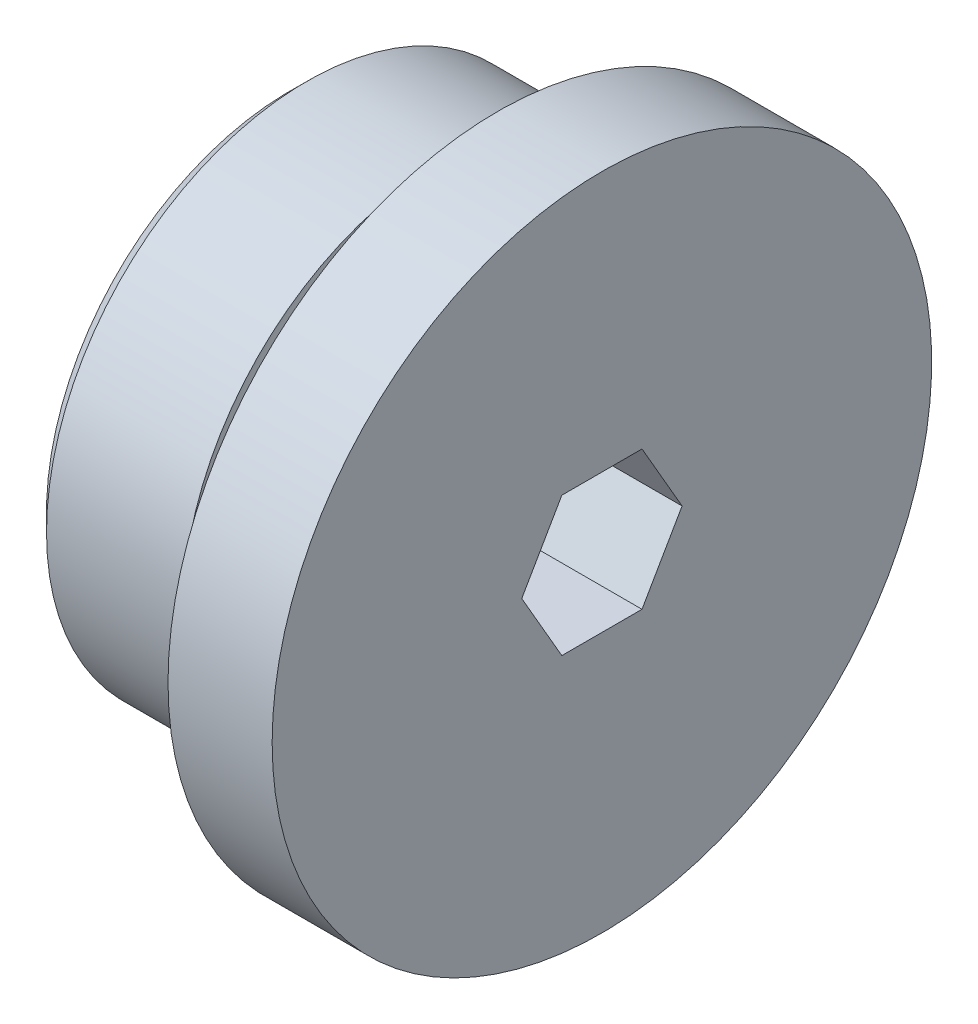
ISO-10303-21;
HEADER;
FILE_DESCRIPTION(('STEP AP214'),'2;1');
FILE_NAME('part.step','',(''),(''),'','','');
FILE_SCHEMA(('AUTOMOTIVE_DESIGN { 1 0 10303 214 1 1 1 1 }'));
ENDSEC;
DATA;
#1=APPLICATION_CONTEXT('core data for automotive mechanical design processes');
#2=APPLICATION_PROTOCOL_DEFINITION('international standard','automotive_design',2000,#1);
#3=PRODUCT_CONTEXT('',#1,'mechanical');
#4=PRODUCT('Part','Part','',(#3));
#5=PRODUCT_RELATED_PRODUCT_CATEGORY('part','',(#4));
#6=PRODUCT_DEFINITION_FORMATION('','',#4);
#7=PRODUCT_DEFINITION_CONTEXT('part definition',#1,'design');
#8=PRODUCT_DEFINITION('design','',#6,#7);
#9=PRODUCT_DEFINITION_SHAPE('','',#8);
#10=(LENGTH_UNIT() NAMED_UNIT(*) SI_UNIT(.MILLI.,.METRE.));
#11=(NAMED_UNIT(*) PLANE_ANGLE_UNIT() SI_UNIT($,.RADIAN.));
#12=(NAMED_UNIT(*) SI_UNIT($,.STERADIAN.) SOLID_ANGLE_UNIT());
#13=UNCERTAINTY_MEASURE_WITH_UNIT(LENGTH_MEASURE(1.E-05),#10,'distance_accuracy_value','');
#14=(GEOMETRIC_REPRESENTATION_CONTEXT(3) GLOBAL_UNCERTAINTY_ASSIGNED_CONTEXT((#13)) GLOBAL_UNIT_ASSIGNED_CONTEXT((#10,
#11,#12)) REPRESENTATION_CONTEXT('',''));
#15=CARTESIAN_POINT('',(0.,0.,0.));
#16=DIRECTION('',(0.,0.,1.));
#17=DIRECTION('',(1.,0.,0.));
#18=AXIS2_PLACEMENT_3D('',#15,#16,#17);
#19=CARTESIAN_POINT('',(18.,19.,0.));
#20=DIRECTION('',(-1.,0.,0.));
#21=DIRECTION('',(0.,0.,0.999999999999997));
#22=AXIS2_PLACEMENT_3D('',#19,#20,#21);
#23=PLANE('',#22);
#24=DIRECTION('',(0.,0.,-0.999999999999997));
#25=VECTOR('',#24,1.);
#26=CARTESIAN_POINT('',(18.,-3.99999999999996,2.30940107675849));
#27=LINE('',#26,#25);
#28=CARTESIAN_POINT('',(18.,-3.99999999999996,2.30940107675849));
#29=VERTEX_POINT('',#28);
#30=CARTESIAN_POINT('',(18.,-3.9999999999999,-2.3094010767586));
#31=VERTEX_POINT('',#30);
#32=EDGE_CURVE('E49',#29,#31,#27,.T.);
#33=ORIENTED_EDGE('',*,*,#32,.F.);
#34=DIRECTION('',(0.,-0.866025403784436,-0.499999999999991));
#35=VECTOR('',#34,1.);
#36=CARTESIAN_POINT('',(18.0000000000001,0.,4.6188021535169));
#37=LINE('',#36,#35);
#38=CARTESIAN_POINT('',(18.0000000000001,0.,4.6188021535169));
#39=VERTEX_POINT('',#38);
#40=EDGE_CURVE('E125',#39,#29,#37,.T.);
#41=ORIENTED_EDGE('',*,*,#40,.F.);
#42=DIRECTION('',(0.,-0.866025403784442,0.499999999999993));
#43=VECTOR('',#42,1.);
#44=CARTESIAN_POINT('',(18.0000000000001,0.,4.6188021535169));
#45=LINE('',#44,#43);
#46=CARTESIAN_POINT('',(18.0000000000001,4.00000000000009,2.30940107675844));
#47=VERTEX_POINT('',#46);
#48=EDGE_CURVE('E119',#47,#39,#45,.T.);
#49=ORIENTED_EDGE('',*,*,#48,.F.);
#50=DIRECTION('',(0.,0.,0.999999999999997));
#51=VECTOR('',#50,1.);
#52=CARTESIAN_POINT('',(18.0000000000001,4.00000000000009,2.30940107675844));
#53=LINE('',#52,#51);
#54=CARTESIAN_POINT('',(18.,4.00000000000005,-2.30940107675849));
#55=VERTEX_POINT('',#54);
#56=EDGE_CURVE('E157',#55,#47,#53,.T.);
#57=ORIENTED_EDGE('',*,*,#56,.F.);
#58=DIRECTION('',(0.,0.866025403784436,0.499999999999991));
#59=VECTOR('',#58,1.);
#60=CARTESIAN_POINT('',(18.,0.,-4.61880215351697));
#61=LINE('',#60,#59);
#62=CARTESIAN_POINT('',(18.,0.,-4.61880215351697));
#63=VERTEX_POINT('',#62);
#64=EDGE_CURVE('E154',#63,#55,#61,.T.);
#65=ORIENTED_EDGE('',*,*,#64,.F.);
#66=DIRECTION('',(0.,0.866025403784442,-0.499999999999993));
#67=VECTOR('',#66,1.);
#68=CARTESIAN_POINT('',(18.,0.,-4.61880215351697));
#69=LINE('',#68,#67);
#70=EDGE_CURVE('E151',#31,#63,#69,.T.);
#71=ORIENTED_EDGE('',*,*,#70,.F.);
#72=EDGE_LOOP('',(#33,#41,#49,#57,#65,#71));
#73=FACE_BOUND('',#72,.T.);
#74=CARTESIAN_POINT('',(18.,0.,0.));
#75=DIRECTION('',(-1.,0.,0.));
#76=DIRECTION('',(0.,0.,0.999999999999997));
#77=AXIS2_PLACEMENT_3D('',#74,#75,#76);
#78=CIRCLE('',#77,19.);
#79=CARTESIAN_POINT('',(18.0000000000001,0.,18.9999999999999));
#80=VERTEX_POINT('',#79);
#81=EDGE_CURVE('E187',#80,#80,#78,.T.);
#82=ORIENTED_EDGE('',*,*,#81,.F.);
#83=EDGE_LOOP('',(#82));
#84=FACE_BOUND('',#83,.T.);
#85=ADVANCED_FACE('F34',(#73,#84),#23,.F.);
#86=CARTESIAN_POINT('',(0.,0.,0.));
#87=DIRECTION('',(-1.,0.,0.));
#88=DIRECTION('',(0.,0.,0.999999999999997));
#89=AXIS2_PLACEMENT_3D('',#86,#87,#88);
#90=CYLINDRICAL_SURFACE('',#89,19.);
#91=CARTESIAN_POINT('',(12.0000000000001,0.,0.));
#92=DIRECTION('',(-1.,0.,0.));
#93=DIRECTION('',(0.,0.,0.999999999999997));
#94=AXIS2_PLACEMENT_3D('',#91,#92,#93);
#95=CIRCLE('',#94,19.);
#96=CARTESIAN_POINT('',(12.0000000000001,0.,18.9999999999999));
#97=VERTEX_POINT('',#96);
#98=EDGE_CURVE('E184',#97,#97,#95,.T.);
#99=ORIENTED_EDGE('',*,*,#98,.F.);
#100=EDGE_LOOP('',(#99));
#101=FACE_BOUND('',#100,.T.);
#102=ORIENTED_EDGE('',*,*,#81,.T.);
#103=EDGE_LOOP('',(#102));
#104=FACE_BOUND('',#103,.T.);
#105=ADVANCED_FACE('F242',(#101,#104),#90,.T.);
#106=CARTESIAN_POINT('',(12.,15.0000000000001,0.));
#107=DIRECTION('',(1.,0.,0.));
#108=DIRECTION('',(0.,0.,-0.999999999999997));
#109=AXIS2_PLACEMENT_3D('',#106,#107,#108);
#110=PLANE('',#109);
#111=CARTESIAN_POINT('',(12.0000000000001,0.,0.));
#112=DIRECTION('',(-1.,0.,0.));
#113=DIRECTION('',(0.,0.,0.999999999999997));
#114=AXIS2_PLACEMENT_3D('',#111,#112,#113);
#115=CIRCLE('',#114,15.);
#116=CARTESIAN_POINT('',(12.0000000000001,0.,14.9999999999999));
#117=VERTEX_POINT('',#116);
#118=EDGE_CURVE('E181',#117,#117,#115,.T.);
#119=ORIENTED_EDGE('',*,*,#118,.F.);
#120=EDGE_LOOP('',(#119));
#121=FACE_BOUND('',#120,.T.);
#122=ORIENTED_EDGE('',*,*,#98,.T.);
#123=EDGE_LOOP('',(#122));
#124=FACE_BOUND('',#123,.T.);
#125=ADVANCED_FACE('F246',(#121,#124),#110,.F.);
#126=CARTESIAN_POINT('',(10.430076842212,0.,0.));
#127=DIRECTION('',(-1.,0.,0.));
#128=DIRECTION('',(0.,0.,0.999999999999997));
#129=AXIS2_PLACEMENT_3D('',#126,#127,#128);
#130=TOROIDAL_SURFACE('',#129,15.,1.56992315778797);
#131=CARTESIAN_POINT('',(8.86015368442411,1.11022302462516E-13,-1.38777878078145E-13));
#132=DIRECTION('',(-1.,0.,0.));
#133=DIRECTION('',(0.,0.,0.999999999999997));
#134=AXIS2_PLACEMENT_3D('',#131,#132,#133);
#135=CIRCLE('',#134,15.);
#136=CARTESIAN_POINT('',(8.86015368442412,0.,14.9999999999998));
#137=VERTEX_POINT('',#136);
#138=EDGE_CURVE('E178',#137,#137,#135,.T.);
#139=ORIENTED_EDGE('',*,*,#138,.F.);
#140=EDGE_LOOP('',(#139));
#141=FACE_BOUND('',#140,.T.);
#142=ORIENTED_EDGE('',*,*,#118,.T.);
#143=EDGE_LOOP('',(#142));
#144=FACE_BOUND('',#143,.T.);
#145=ADVANCED_FACE('F252',(#141,#144),#130,.F.);
#146=CARTESIAN_POINT('',(0.,0.,0.));
#147=DIRECTION('',(-1.,0.,0.));
#148=DIRECTION('',(0.,0.,0.999999999999997));
#149=AXIS2_PLACEMENT_3D('',#146,#147,#148);
#150=CYLINDRICAL_SURFACE('',#149,15.);
#151=CARTESIAN_POINT('',(1.,0.,0.));
#152=DIRECTION('',(1.,0.,0.));
#153=DIRECTION('',(0.,0.,-0.999999999999997));
#154=AXIS2_PLACEMENT_3D('',#151,#152,#153);
#155=CIRCLE('',#154,15.);
#156=CARTESIAN_POINT('',(0.999999999999988,1.93178806284777E-13,-15.));
#157=VERTEX_POINT('',#156);
#158=EDGE_CURVE('E11',#157,#157,#155,.T.);
#159=ORIENTED_EDGE('',*,*,#158,.T.);
#160=EDGE_LOOP('',(#159));
#161=FACE_BOUND('',#160,.T.);
#162=ORIENTED_EDGE('',*,*,#138,.T.);
#163=EDGE_LOOP('',(#162));
#164=FACE_BOUND('',#163,.T.);
#165=ADVANCED_FACE('F256',(#161,#164),#150,.T.);
#166=CARTESIAN_POINT('',(0.,0.,0.));
#167=DIRECTION('',(1.,0.,0.));
#168=DIRECTION('',(0.,0.,-0.999999999999997));
#169=AXIS2_PLACEMENT_3D('',#166,#167,#168);
#170=PLANE('',#169);
#171=CARTESIAN_POINT('',(0.,0.,0.));
#172=DIRECTION('',(1.,0.,0.));
#173=DIRECTION('',(0.,0.,-0.999999999999997));
#174=AXIS2_PLACEMENT_3D('',#171,#172,#173);
#175=CIRCLE('',#174,14.);
#176=CARTESIAN_POINT('',(0.,1.78912440418344E-13,-14.));
#177=VERTEX_POINT('',#176);
#178=EDGE_CURVE('E42',#177,#177,#175,.F.);
#179=ORIENTED_EDGE('',*,*,#178,.T.);
#180=EDGE_LOOP('',(#179));
#181=FACE_BOUND('',#180,.T.);
#182=ADVANCED_FACE('F260',(#181),#170,.F.);
#183=CARTESIAN_POINT('',(10.,0.,4.61880215351694));
#184=DIRECTION('',(0.,-0.499999999999997,0.866025403784439));
#185=DIRECTION('',(0.,-0.866025403784436,-0.499999999999991));
#186=AXIS2_PLACEMENT_3D('',#183,#184,#185);
#187=PLANE('',#186);
#188=ORIENTED_EDGE('',*,*,#40,.T.);
#189=DIRECTION('',(1.,0.,0.));
#190=VECTOR('',#189,1.);
#191=CARTESIAN_POINT('',(9.99999999999998,-3.99999999999996,2.30940107675849));
#192=LINE('',#191,#190);
#193=CARTESIAN_POINT('',(9.99999999999998,-3.99999999999996,2.30940107675849));
#194=VERTEX_POINT('',#193);
#195=EDGE_CURVE('E122',#194,#29,#192,.T.);
#196=ORIENTED_EDGE('',*,*,#195,.F.);
#197=DIRECTION('',(0.,-0.866025403784436,-0.499999999999991));
#198=VECTOR('',#197,1.);
#199=CARTESIAN_POINT('',(10.,0.,4.61880215351694));
#200=LINE('',#199,#198);
#201=CARTESIAN_POINT('',(10.0000000000001,-1.99999999999984,3.46410161513759));
#202=VERTEX_POINT('',#201);
#203=EDGE_CURVE('E108',#202,#194,#200,.T.);
#204=ORIENTED_EDGE('',*,*,#203,.F.);
#205=CARTESIAN_POINT('',(10.,0.,4.61880215351694));
#206=VERTEX_POINT('',#205);
#207=EDGE_CURVE('E118',#206,#202,#200,.T.);
#208=ORIENTED_EDGE('',*,*,#207,.F.);
#209=DIRECTION('',(1.,0.,0.));
#210=VECTOR('',#209,1.);
#211=CARTESIAN_POINT('',(10.,0.,4.61880215351694));
#212=LINE('',#211,#210);
#213=EDGE_CURVE('E162',#206,#39,#212,.T.);
#214=ORIENTED_EDGE('',*,*,#213,.T.);
#215=EDGE_LOOP('',(#188,#196,#204,#208,#214));
#216=FACE_BOUND('',#215,.T.);
#217=ADVANCED_FACE('F123',(#216),#187,.F.);
#218=CARTESIAN_POINT('',(10.,0.,4.61880215351694));
#219=DIRECTION('',(0.,0.499999999999985,0.86602540378444));
#220=DIRECTION('',(0.,-0.866025403784442,0.499999999999993));
#221=AXIS2_PLACEMENT_3D('',#218,#219,#220);
#222=PLANE('',#221);
#223=ORIENTED_EDGE('',*,*,#48,.T.);
#224=ORIENTED_EDGE('',*,*,#213,.F.);
#225=DIRECTION('',(0.,-0.866025403784442,0.499999999999993));
#226=VECTOR('',#225,1.);
#227=CARTESIAN_POINT('',(10.,0.,4.61880215351694));
#228=LINE('',#227,#226);
#229=CARTESIAN_POINT('',(10.,2.00000000000002,3.46410161513776));
#230=VERTEX_POINT('',#229);
#231=EDGE_CURVE('E146',#230,#206,#228,.T.);
#232=ORIENTED_EDGE('',*,*,#231,.F.);
#233=CARTESIAN_POINT('',(10.,4.00000000000012,2.30940107675835));
#234=VERTEX_POINT('',#233);
#235=EDGE_CURVE('E128',#234,#230,#228,.T.);
#236=ORIENTED_EDGE('',*,*,#235,.F.);
#237=DIRECTION('',(1.,0.,0.));
#238=VECTOR('',#237,1.);
#239=CARTESIAN_POINT('',(10.,4.00000000000012,2.30940107675835));
#240=LINE('',#239,#238);
#241=EDGE_CURVE('E165',#234,#47,#240,.T.);
#242=ORIENTED_EDGE('',*,*,#241,.T.);
#243=EDGE_LOOP('',(#223,#224,#232,#236,#242));
#244=FACE_BOUND('',#243,.T.);
#245=ADVANCED_FACE('F231',(#244),#222,.F.);
#246=CARTESIAN_POINT('',(10.,4.00000000000012,2.30940107675835));
#247=DIRECTION('',(0.,1.,0.));
#248=DIRECTION('',(0.,0.,0.999999999999997));
#249=AXIS2_PLACEMENT_3D('',#246,#247,#248);
#250=PLANE('',#249);
#251=ORIENTED_EDGE('',*,*,#56,.T.);
#252=ORIENTED_EDGE('',*,*,#241,.F.);
#253=DIRECTION('',(0.,0.,0.999999999999997));
#254=VECTOR('',#253,1.);
#255=CARTESIAN_POINT('',(10.,4.00000000000012,2.30940107675835));
#256=LINE('',#255,#254);
#257=CARTESIAN_POINT('',(10.,4.00000000000005,0.));
#258=VERTEX_POINT('',#257);
#259=EDGE_CURVE('E142',#258,#234,#256,.T.);
#260=ORIENTED_EDGE('',*,*,#259,.F.);
#261=CARTESIAN_POINT('',(10.,4.00000000000011,-2.30940107675856));
#262=VERTEX_POINT('',#261);
#263=EDGE_CURVE('E143',#262,#258,#256,.T.);
#264=ORIENTED_EDGE('',*,*,#263,.F.);
#265=DIRECTION('',(1.,0.,0.));
#266=VECTOR('',#265,1.);
#267=CARTESIAN_POINT('',(10.,4.00000000000011,-2.30940107675856));
#268=LINE('',#267,#266);
#269=EDGE_CURVE('E168',#262,#55,#268,.T.);
#270=ORIENTED_EDGE('',*,*,#269,.T.);
#271=EDGE_LOOP('',(#251,#252,#260,#264,#270));
#272=FACE_BOUND('',#271,.T.);
#273=ADVANCED_FACE('F226',(#272),#250,.F.);
#274=CARTESIAN_POINT('',(10.,1.31838984174237E-13,-4.61880215351713));
#275=DIRECTION('',(0.,0.499999999999997,-0.866025403784439));
#276=DIRECTION('',(0.,0.866025403784436,0.499999999999991));
#277=AXIS2_PLACEMENT_3D('',#274,#275,#276);
#278=PLANE('',#277);
#279=ORIENTED_EDGE('',*,*,#64,.T.);
#280=ORIENTED_EDGE('',*,*,#269,.F.);
#281=DIRECTION('',(0.,0.866025403784436,0.499999999999991));
#282=VECTOR('',#281,1.);
#283=CARTESIAN_POINT('',(10.,1.31838984174237E-13,-4.61880215351713));
#284=LINE('',#283,#282);
#285=CARTESIAN_POINT('',(10.,2.00000000000004,-3.46410161513779));
#286=VERTEX_POINT('',#285);
#287=EDGE_CURVE('E140',#286,#262,#284,.T.);
#288=ORIENTED_EDGE('',*,*,#287,.F.);
#289=CARTESIAN_POINT('',(10.,1.31838984174237E-13,-4.61880215351713));
#290=VERTEX_POINT('',#289);
#291=EDGE_CURVE('E57',#290,#286,#284,.T.);
#292=ORIENTED_EDGE('',*,*,#291,.F.);
#293=DIRECTION('',(1.,0.,0.));
#294=VECTOR('',#293,1.);
#295=CARTESIAN_POINT('',(10.,1.31838984174237E-13,-4.61880215351713));
#296=LINE('',#295,#294);
#297=EDGE_CURVE('E171',#290,#63,#296,.T.);
#298=ORIENTED_EDGE('',*,*,#297,.T.);
#299=EDGE_LOOP('',(#279,#280,#288,#292,#298));
#300=FACE_BOUND('',#299,.T.);
#301=ADVANCED_FACE('F224',(#300),#278,.F.);
#302=CARTESIAN_POINT('',(10.,1.31838984174237E-13,-4.61880215351713));
#303=DIRECTION('',(0.,-0.499999999999985,-0.86602540378444));
#304=DIRECTION('',(0.,0.866025403784442,-0.499999999999993));
#305=AXIS2_PLACEMENT_3D('',#302,#303,#304);
#306=PLANE('',#305);
#307=ORIENTED_EDGE('',*,*,#70,.T.);
#308=ORIENTED_EDGE('',*,*,#297,.F.);
#309=DIRECTION('',(0.,0.866025403784442,-0.499999999999993));
#310=VECTOR('',#309,1.);
#311=CARTESIAN_POINT('',(10.,1.31838984174237E-13,-4.61880215351713));
#312=LINE('',#311,#310);
#313=CARTESIAN_POINT('',(10.,-1.99999999999991,-3.46410161513776));
#314=VERTEX_POINT('',#313);
#315=EDGE_CURVE('E134',#314,#290,#312,.T.);
#316=ORIENTED_EDGE('',*,*,#315,.F.);
#317=CARTESIAN_POINT('',(10.0000000000001,-3.99999999999973,-2.30940107675885));
#318=VERTEX_POINT('',#317);
#319=EDGE_CURVE('E136',#318,#314,#312,.T.);
#320=ORIENTED_EDGE('',*,*,#319,.F.);
#321=DIRECTION('',(1.,0.,0.));
#322=VECTOR('',#321,1.);
#323=CARTESIAN_POINT('',(10.0000000000001,-3.99999999999973,-2.30940107675885));
#324=LINE('',#323,#322);
#325=EDGE_CURVE('E127',#318,#31,#324,.T.);
#326=ORIENTED_EDGE('',*,*,#325,.T.);
#327=EDGE_LOOP('',(#307,#308,#316,#320,#326));
#328=FACE_BOUND('',#327,.T.);
#329=ADVANCED_FACE('F220',(#328),#306,.F.);
#330=CARTESIAN_POINT('',(9.99999999999998,-3.99999999999996,2.30940107675849));
#331=DIRECTION('',(0.,-1.,0.));
#332=DIRECTION('',(0.,0.,-0.999999999999997));
#333=AXIS2_PLACEMENT_3D('',#330,#331,#332);
#334=PLANE('',#333);
#335=ORIENTED_EDGE('',*,*,#32,.T.);
#336=ORIENTED_EDGE('',*,*,#325,.F.);
#337=DIRECTION('',(0.,0.,-0.999999999999997));
#338=VECTOR('',#337,1.);
#339=CARTESIAN_POINT('',(9.99999999999998,-3.99999999999996,2.30940107675849));
#340=LINE('',#339,#338);
#341=CARTESIAN_POINT('',(10.,-3.99999999999991,0.));
#342=VERTEX_POINT('',#341);
#343=EDGE_CURVE('E133',#342,#318,#340,.T.);
#344=ORIENTED_EDGE('',*,*,#343,.F.);
#345=EDGE_CURVE('E112',#194,#342,#340,.T.);
#346=ORIENTED_EDGE('',*,*,#345,.F.);
#347=ORIENTED_EDGE('',*,*,#195,.T.);
#348=EDGE_LOOP('',(#335,#336,#344,#346,#347));
#349=FACE_BOUND('',#348,.T.);
#350=ADVANCED_FACE('F131',(#349),#334,.F.);
#351=CARTESIAN_POINT('',(9.99999999999998,-3.99999999999996,2.30940107675849));
#352=DIRECTION('',(1.,0.,0.));
#353=DIRECTION('',(0.,0.,-0.999999999999997));
#354=AXIS2_PLACEMENT_3D('',#351,#352,#353);
#355=PLANE('',#354);
#356=CARTESIAN_POINT('',(10.,1.04083408558608E-13,0.));
#357=DIRECTION('',(1.,0.,0.));
#358=DIRECTION('',(0.,0.,-0.999999999999997));
#359=AXIS2_PLACEMENT_3D('',#356,#357,#358);
#360=CIRCLE('',#359,4.);
#361=EDGE_CURVE('E192',#314,#342,#360,.F.);
#362=ORIENTED_EDGE('',*,*,#361,.T.);
#363=ORIENTED_EDGE('',*,*,#343,.T.);
#364=ORIENTED_EDGE('',*,*,#319,.T.);
#365=EDGE_LOOP('',(#362,#363,#364));
#366=FACE_BOUND('',#365,.T.);
#367=ADVANCED_FACE('F221',(#366),#355,.T.);
#368=EDGE_CURVE('E114',#342,#202,#360,.F.);
#369=ORIENTED_EDGE('',*,*,#368,.T.);
#370=ORIENTED_EDGE('',*,*,#203,.T.);
#371=ORIENTED_EDGE('',*,*,#345,.T.);
#372=EDGE_LOOP('',(#369,#370,#371));
#373=FACE_BOUND('',#372,.T.);
#374=ADVANCED_FACE('F110',(#373),#355,.T.);
#375=EDGE_CURVE('E198',#202,#230,#360,.F.);
#376=ORIENTED_EDGE('',*,*,#375,.T.);
#377=ORIENTED_EDGE('',*,*,#231,.T.);
#378=ORIENTED_EDGE('',*,*,#207,.T.);
#379=EDGE_LOOP('',(#376,#377,#378));
#380=FACE_BOUND('',#379,.T.);
#381=ADVANCED_FACE('F233',(#380),#355,.T.);
#382=EDGE_CURVE('E199',#230,#258,#360,.F.);
#383=ORIENTED_EDGE('',*,*,#382,.T.);
#384=ORIENTED_EDGE('',*,*,#259,.T.);
#385=ORIENTED_EDGE('',*,*,#235,.T.);
#386=EDGE_LOOP('',(#383,#384,#385));
#387=FACE_BOUND('',#386,.T.);
#388=ADVANCED_FACE('F229',(#387),#355,.T.);
#389=EDGE_CURVE('E191',#258,#286,#360,.F.);
#390=ORIENTED_EDGE('',*,*,#389,.T.);
#391=ORIENTED_EDGE('',*,*,#287,.T.);
#392=ORIENTED_EDGE('',*,*,#263,.T.);
#393=EDGE_LOOP('',(#390,#391,#392));
#394=FACE_BOUND('',#393,.T.);
#395=ADVANCED_FACE('F210',(#394),#355,.T.);
#396=EDGE_CURVE('E190',#286,#314,#360,.F.);
#397=ORIENTED_EDGE('',*,*,#396,.T.);
#398=ORIENTED_EDGE('',*,*,#315,.T.);
#399=ORIENTED_EDGE('',*,*,#291,.T.);
#400=EDGE_LOOP('',(#397,#398,#399));
#401=FACE_BOUND('',#400,.T.);
#402=ADVANCED_FACE('F216',(#401),#355,.T.);
#403=CARTESIAN_POINT('',(8.00000000000004,0.,0.));
#404=DIRECTION('',(1.,0.,0.));
#405=DIRECTION('',(0.,0.,-0.999999999999997));
#406=AXIS2_PLACEMENT_3D('',#403,#404,#405);
#407=CONICAL_SURFACE('',#406,4.,1.02974425867665);
#408=CARTESIAN_POINT('',(5.59655752388968,2.15105711021124E-13,-3.19189119579733E-13));
#409=VERTEX_POINT('',#408);
#410=VERTEX_LOOP('',#409);
#411=FACE_BOUND('',#410,.T.);
#412=CARTESIAN_POINT('',(8.00000000000004,0.,0.));
#413=DIRECTION('',(1.,0.,0.));
#414=DIRECTION('',(0.,0.,-0.999999999999997));
#415=AXIS2_PLACEMENT_3D('',#412,#413,#414);
#416=CIRCLE('',#415,4.);
#417=CARTESIAN_POINT('',(8.00000000000003,1.19515508600898E-13,-4.00000000000008));
#418=VERTEX_POINT('',#417);
#419=EDGE_CURVE('E164',#418,#418,#416,.T.);
#420=ORIENTED_EDGE('',*,*,#419,.T.);
#421=EDGE_LOOP('',(#420));
#422=FACE_BOUND('',#421,.T.);
#423=ADVANCED_FACE('F266',(#411,#422),#407,.F.);
#424=CARTESIAN_POINT('',(18.,0.,0.));
#425=DIRECTION('',(1.,0.,0.));
#426=DIRECTION('',(0.,0.,-0.999999999999997));
#427=AXIS2_PLACEMENT_3D('',#424,#425,#426);
#428=CYLINDRICAL_SURFACE('',#427,4.);
#429=ORIENTED_EDGE('',*,*,#419,.F.);
#430=EDGE_LOOP('',(#429));
#431=FACE_BOUND('',#430,.T.);
#432=ORIENTED_EDGE('',*,*,#361,.F.);
#433=ORIENTED_EDGE('',*,*,#396,.F.);
#434=ORIENTED_EDGE('',*,*,#389,.F.);
#435=ORIENTED_EDGE('',*,*,#382,.F.);
#436=ORIENTED_EDGE('',*,*,#375,.F.);
#437=ORIENTED_EDGE('',*,*,#368,.F.);
#438=EDGE_LOOP('',(#432,#433,#434,#435,#436,#437));
#439=FACE_BOUND('',#438,.T.);
#440=ADVANCED_FACE('F214',(#431,#439),#428,.F.);
#441=CARTESIAN_POINT('',(0.,0.,0.));
#442=DIRECTION('',(1.,0.,0.));
#443=DIRECTION('',(0.,0.,-0.999999999999997));
#444=AXIS2_PLACEMENT_3D('',#441,#442,#443);
#445=CONICAL_SURFACE('',#444,14.,0.785398163397445);
#446=ORIENTED_EDGE('',*,*,#158,.F.);
#447=EDGE_LOOP('',(#446));
#448=FACE_BOUND('',#447,.T.);
#449=ORIENTED_EDGE('',*,*,#178,.F.);
#450=EDGE_LOOP('',(#449));
#451=FACE_BOUND('',#450,.T.);
#452=ADVANCED_FACE('F36',(#448,#451),#445,.T.);
#453=CLOSED_SHELL('',(#85,#105,#125,#145,#165,#182,#217,#245,#273,#301,#329,#350,#367,#374,#381,
#388,#395,#402,#423,#440,#452));
#454=MANIFOLD_SOLID_BREP('B2',#453);
#455=ADVANCED_BREP_SHAPE_REPRESENTATION('',(#18,#454),#14);
#456=SHAPE_DEFINITION_REPRESENTATION(#9,#455);
ENDSEC;
END-ISO-10303-21;
